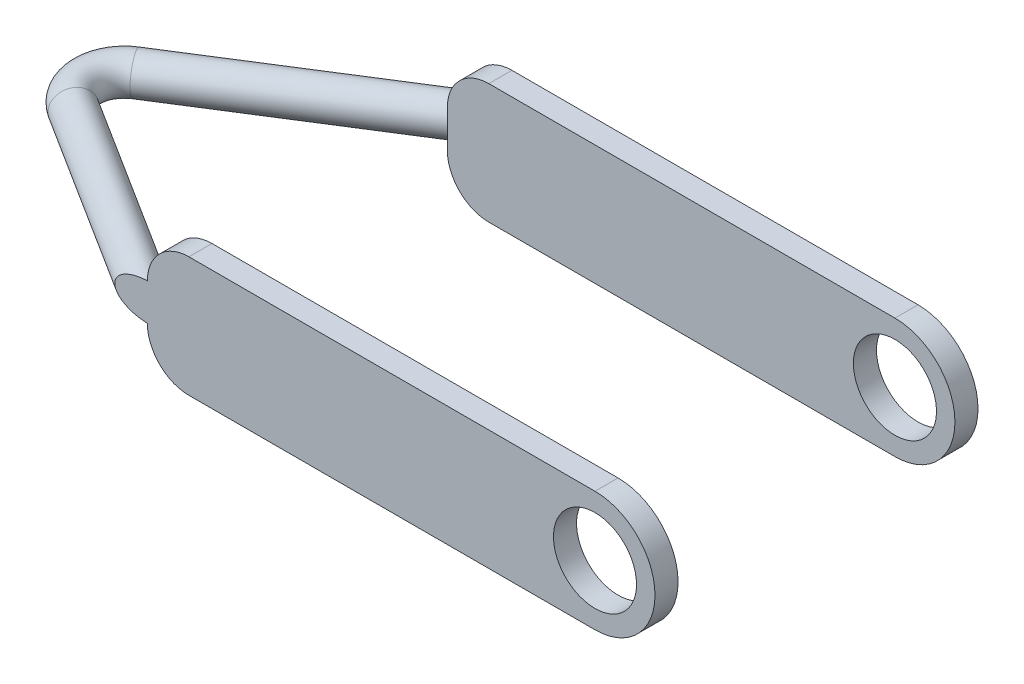
ISO-10303-21;
HEADER;
FILE_DESCRIPTION(('STEP AP214'),'2;1');
FILE_NAME('part.step','',(''),(''),'','','');
FILE_SCHEMA(('AUTOMOTIVE_DESIGN { 1 0 10303 214 1 1 1 1 }'));
ENDSEC;
DATA;
#1=APPLICATION_CONTEXT('core data for automotive mechanical design processes');
#2=APPLICATION_PROTOCOL_DEFINITION('international standard','automotive_design',2000,#1);
#3=PRODUCT_CONTEXT('',#1,'mechanical');
#4=PRODUCT('Part','Part','',(#3));
#5=PRODUCT_RELATED_PRODUCT_CATEGORY('part','',(#4));
#6=PRODUCT_DEFINITION_FORMATION('','',#4);
#7=PRODUCT_DEFINITION_CONTEXT('part definition',#1,'design');
#8=PRODUCT_DEFINITION('design','',#6,#7);
#9=PRODUCT_DEFINITION_SHAPE('','',#8);
#10=(LENGTH_UNIT() NAMED_UNIT(*) SI_UNIT(.MILLI.,.METRE.));
#11=(NAMED_UNIT(*) PLANE_ANGLE_UNIT() SI_UNIT($,.RADIAN.));
#12=(NAMED_UNIT(*) SI_UNIT($,.STERADIAN.) SOLID_ANGLE_UNIT());
#13=UNCERTAINTY_MEASURE_WITH_UNIT(LENGTH_MEASURE(1.E-05),#10,'distance_accuracy_value','');
#14=(GEOMETRIC_REPRESENTATION_CONTEXT(3) GLOBAL_UNCERTAINTY_ASSIGNED_CONTEXT((#13)) GLOBAL_UNIT_ASSIGNED_CONTEXT((#10,
#11,#12)) REPRESENTATION_CONTEXT('',''));
#15=CARTESIAN_POINT('',(0.,0.,0.));
#16=DIRECTION('',(0.,0.,1.));
#17=DIRECTION('',(1.,0.,0.));
#18=AXIS2_PLACEMENT_3D('',#15,#16,#17);
#19=CARTESIAN_POINT('',(44.0000000000021,13.,-30.0000000000036));
#20=DIRECTION('',(-1.,0.,0.));
#21=DIRECTION('',(0.,0.,1.));
#22=AXIS2_PLACEMENT_3D('',#19,#20,#21);
#23=PLANE('',#22);
#24=DIRECTION('',(0.,-1.,0.));
#25=VECTOR('',#24,1.);
#26=CARTESIAN_POINT('',(44.0000000000021,13.,-35.0000000000036));
#27=LINE('',#26,#25);
#28=CARTESIAN_POINT('',(44.0000000000021,-3.99354347611105,-35.0000000000036));
#29=VERTEX_POINT('',#28);
#30=CARTESIAN_POINT('',(44.0000000000021,-3.99999999999994,-35.0000000000036));
#31=VERTEX_POINT('',#30);
#32=EDGE_CURVE('E174',#29,#31,#27,.T.);
#33=ORIENTED_EDGE('',*,*,#32,.T.);
#34=DIRECTION('',(0.,0.,-1.));
#35=VECTOR('',#34,1.);
#36=CARTESIAN_POINT('',(44.0000000000021,-3.99999999999994,-25.0000000000036));
#37=LINE('',#36,#35);
#38=CARTESIAN_POINT('',(44.0000000000021,-3.99999999999994,-34.7312871896512));
#39=VERTEX_POINT('',#38);
#40=EDGE_CURVE('E391',#39,#31,#37,.T.);
#41=ORIENTED_EDGE('',*,*,#40,.F.);
#42=CARTESIAN_POINT('',(44.0000000000021,0.,-34.7312871896512));
#43=DIRECTION('',(1.,0.,0.));
#44=DIRECTION('',(0.,0.,-1.));
#45=AXIS2_PLACEMENT_3D('',#42,#43,#44);
#46=ELLIPSE('',#45,4.73128718964752,4.);
#47=EDGE_CURVE('E265',#29,#39,#46,.F.);
#48=ORIENTED_EDGE('',*,*,#47,.F.);
#49=EDGE_LOOP('',(#33,#41,#48));
#50=FACE_BOUND('',#49,.T.);
#51=ADVANCED_FACE('F36',(#50),#23,.T.);
#52=CARTESIAN_POINT('',(44.0000000000021,0.,-30.0000000000036));
#53=VERTEX_POINT('',#52);
#54=EDGE_CURVE('E269',#39,#53,#46,.F.);
#55=ORIENTED_EDGE('',*,*,#54,.F.);
#56=CARTESIAN_POINT('',(44.0000000000021,-3.99999999999994,-30.0000000000036));
#57=VERTEX_POINT('',#56);
#58=EDGE_CURVE('E293',#57,#39,#37,.T.);
#59=ORIENTED_EDGE('',*,*,#58,.F.);
#60=DIRECTION('',(0.,-1.,0.));
#61=VECTOR('',#60,1.);
#62=CARTESIAN_POINT('',(44.0000000000021,13.,-30.0000000000036));
#63=LINE('',#62,#61);
#64=EDGE_CURVE('E188',#53,#57,#63,.T.);
#65=ORIENTED_EDGE('',*,*,#64,.F.);
#66=EDGE_LOOP('',(#55,#59,#65));
#67=FACE_BOUND('',#66,.T.);
#68=ADVANCED_FACE('F322',(#67),#23,.T.);
#69=CARTESIAN_POINT('',(0.,-13.,0.));
#70=DIRECTION('',(0.,1.,0.));
#71=DIRECTION('',(0.,0.,-1.));
#72=AXIS2_PLACEMENT_3D('',#69,#70,#71);
#73=PLANE('',#72);
#74=DIRECTION('',(0.,0.,-1.));
#75=VECTOR('',#74,1.);
#76=CARTESIAN_POINT('',(53.0000000000021,-13.,-25.0000000000036));
#77=LINE('',#76,#75);
#78=CARTESIAN_POINT('',(53.0000000000022,-13.,-35.0000000000036));
#79=VERTEX_POINT('',#78);
#80=CARTESIAN_POINT('',(53.0000000000022,-13.,-30.0000000000036));
#81=VERTEX_POINT('',#80);
#82=EDGE_CURVE('E11',#79,#81,#77,.F.);
#83=ORIENTED_EDGE('',*,*,#82,.F.);
#84=DIRECTION('',(1.,0.,0.));
#85=VECTOR('',#84,1.);
#86=CARTESIAN_POINT('',(44.0000000000021,-13.,-35.0000000000036));
#87=LINE('',#86,#85);
#88=CARTESIAN_POINT('',(141.000000000002,-13.,-35.0000000000036));
#89=VERTEX_POINT('',#88);
#90=EDGE_CURVE('E179',#79,#89,#87,.T.);
#91=ORIENTED_EDGE('',*,*,#90,.T.);
#92=DIRECTION('',(0.,0.,-1.));
#93=VECTOR('',#92,1.);
#94=CARTESIAN_POINT('',(141.000000000002,-13.,-25.0000000000036));
#95=LINE('',#94,#93);
#96=CARTESIAN_POINT('',(141.000000000002,-13.,-30.0000000000036));
#97=VERTEX_POINT('',#96);
#98=EDGE_CURVE('E44',#89,#97,#95,.F.);
#99=ORIENTED_EDGE('',*,*,#98,.T.);
#100=DIRECTION('',(-1.,0.,0.));
#101=VECTOR('',#100,1.);
#102=CARTESIAN_POINT('',(154.000000000002,-13.,-30.0000000000036));
#103=LINE('',#102,#101);
#104=EDGE_CURVE('E183',#97,#81,#103,.T.);
#105=ORIENTED_EDGE('',*,*,#104,.T.);
#106=EDGE_LOOP('',(#83,#91,#99,#105));
#107=FACE_BOUND('',#106,.T.);
#108=ADVANCED_FACE('F279',(#107),#73,.F.);
#109=CARTESIAN_POINT('',(0.,-10.,-35.0000000000036));
#110=DIRECTION('',(0.,0.,-1.));
#111=DIRECTION('',(-1.,0.,0.));
#112=AXIS2_PLACEMENT_3D('',#109,#110,#111);
#113=PLANE('',#112);
#114=DIRECTION('',(1.,0.,0.));
#115=VECTOR('',#114,1.);
#116=CARTESIAN_POINT('',(44.0000000000021,13.,-35.0000000000036));
#117=LINE('',#116,#115);
#118=CARTESIAN_POINT('',(53.0000000000022,13.,-35.0000000000036));
#119=VERTEX_POINT('',#118);
#120=CARTESIAN_POINT('',(141.000000000002,13.,-35.0000000000036));
#121=VERTEX_POINT('',#120);
#122=EDGE_CURVE('E166',#119,#121,#117,.T.);
#123=ORIENTED_EDGE('',*,*,#122,.T.);
#124=CARTESIAN_POINT('',(141.000000000002,0.,-35.0000000000036));
#125=DIRECTION('',(0.,0.,1.));
#126=DIRECTION('',(1.,0.,0.));
#127=AXIS2_PLACEMENT_3D('',#124,#125,#126);
#128=CIRCLE('',#127,13.);
#129=EDGE_CURVE('E152',#89,#121,#128,.T.);
#130=ORIENTED_EDGE('',*,*,#129,.F.);
#131=ORIENTED_EDGE('',*,*,#90,.F.);
#132=CARTESIAN_POINT('',(53.0000000000021,-4.,-35.0000000000036));
#133=DIRECTION('',(0.,0.,1.));
#134=DIRECTION('',(1.,0.,0.));
#135=AXIS2_PLACEMENT_3D('',#132,#133,#134);
#136=CIRCLE('',#135,9.);
#137=EDGE_CURVE('E58',#31,#79,#136,.T.);
#138=ORIENTED_EDGE('',*,*,#137,.F.);
#139=ORIENTED_EDGE('',*,*,#32,.F.);
#140=CARTESIAN_POINT('',(44.4253684188356,0.,-35.0000000000036));
#141=DIRECTION('',(0.,0.,-1.));
#142=DIRECTION('',(1.,0.,0.));
#143=AXIS2_PLACEMENT_3D('',#140,#141,#142);
#144=ELLIPSE('',#143,7.48955789739853,4.);
#145=CARTESIAN_POINT('',(44.0000000000021,3.99354347611105,-35.0000000000036));
#146=VERTEX_POINT('',#145);
#147=EDGE_CURVE('E268',#146,#29,#144,.F.);
#148=ORIENTED_EDGE('',*,*,#147,.F.);
#149=CARTESIAN_POINT('',(44.0000000000021,3.99999999999994,-35.0000000000036));
#150=VERTEX_POINT('',#149);
#151=EDGE_CURVE('E177',#150,#146,#27,.T.);
#152=ORIENTED_EDGE('',*,*,#151,.F.);
#153=CARTESIAN_POINT('',(53.0000000000021,4.,-35.0000000000036));
#154=DIRECTION('',(0.,0.,-1.));
#155=DIRECTION('',(-1.,0.,0.));
#156=AXIS2_PLACEMENT_3D('',#153,#154,#155);
#157=CIRCLE('',#156,9.);
#158=EDGE_CURVE('E173',#150,#119,#157,.T.);
#159=ORIENTED_EDGE('',*,*,#158,.T.);
#160=EDGE_LOOP('',(#123,#130,#131,#138,#139,#148,#152,#159));
#161=FACE_BOUND('',#160,.T.);
#162=CARTESIAN_POINT('',(141.000000000002,0.,-35.0000000000036));
#163=DIRECTION('',(0.,0.,-1.));
#164=DIRECTION('',(-1.,0.,0.));
#165=AXIS2_PLACEMENT_3D('',#162,#163,#164);
#166=CIRCLE('',#165,9.00000000000001);
#167=CARTESIAN_POINT('',(132.000000000002,0.,-35.0000000000036));
#168=VERTEX_POINT('',#167);
#169=EDGE_CURVE('E186',#168,#168,#166,.F.);
#170=ORIENTED_EDGE('',*,*,#169,.T.);
#171=EDGE_LOOP('',(#170));
#172=FACE_BOUND('',#171,.T.);
#173=ADVANCED_FACE('F170',(#161,#172),#113,.T.);
#174=CARTESIAN_POINT('',(44.0000000000021,3.99999999999994,-30.0000000000036));
#175=VERTEX_POINT('',#174);
#176=EDGE_CURVE('E189',#175,#53,#63,.T.);
#177=ORIENTED_EDGE('',*,*,#176,.F.);
#178=DIRECTION('',(0.,0.,-1.));
#179=VECTOR('',#178,1.);
#180=CARTESIAN_POINT('',(44.0000000000021,3.99999999999994,-22.0000000000036));
#181=LINE('',#180,#179);
#182=CARTESIAN_POINT('',(44.0000000000021,3.99999999999994,-34.7312871896512));
#183=VERTEX_POINT('',#182);
#184=EDGE_CURVE('E291',#175,#183,#181,.T.);
#185=ORIENTED_EDGE('',*,*,#184,.T.);
#186=EDGE_CURVE('E270',#53,#183,#46,.F.);
#187=ORIENTED_EDGE('',*,*,#186,.F.);
#188=EDGE_LOOP('',(#177,#185,#187));
#189=FACE_BOUND('',#188,.T.);
#190=ADVANCED_FACE('F317',(#189),#23,.T.);
#191=EDGE_CURVE('E264',#183,#146,#46,.F.);
#192=ORIENTED_EDGE('',*,*,#191,.F.);
#193=EDGE_CURVE('E288',#183,#150,#181,.T.);
#194=ORIENTED_EDGE('',*,*,#193,.T.);
#195=ORIENTED_EDGE('',*,*,#151,.T.);
#196=EDGE_LOOP('',(#192,#194,#195));
#197=FACE_BOUND('',#196,.T.);
#198=ADVANCED_FACE('F309',(#197),#23,.T.);
#199=CARTESIAN_POINT('',(154.000000000002,13.,-30.0000000000036));
#200=DIRECTION('',(0.,0.,1.));
#201=DIRECTION('',(1.,0.,0.));
#202=AXIS2_PLACEMENT_3D('',#199,#200,#201);
#203=PLANE('',#202);
#204=CARTESIAN_POINT('',(141.000000000002,0.,-30.0000000000036));
#205=DIRECTION('',(0.,0.,1.));
#206=DIRECTION('',(1.,0.,0.));
#207=AXIS2_PLACEMENT_3D('',#204,#205,#206);
#208=CIRCLE('',#207,13.);
#209=CARTESIAN_POINT('',(141.000000000002,13.,-30.0000000000036));
#210=VERTEX_POINT('',#209);
#211=EDGE_CURVE('E51',#210,#97,#208,.F.);
#212=ORIENTED_EDGE('',*,*,#211,.F.);
#213=DIRECTION('',(-1.,0.,0.));
#214=VECTOR('',#213,1.);
#215=CARTESIAN_POINT('',(154.000000000002,13.,-30.0000000000036));
#216=LINE('',#215,#214);
#217=CARTESIAN_POINT('',(53.0000000000022,13.,-30.0000000000036));
#218=VERTEX_POINT('',#217);
#219=EDGE_CURVE('E167',#210,#218,#216,.T.);
#220=ORIENTED_EDGE('',*,*,#219,.T.);
#221=CARTESIAN_POINT('',(53.0000000000021,4.,-30.0000000000036));
#222=DIRECTION('',(0.,0.,1.));
#223=DIRECTION('',(1.,0.,0.));
#224=AXIS2_PLACEMENT_3D('',#221,#222,#223);
#225=CIRCLE('',#224,9.);
#226=EDGE_CURVE('E296',#218,#175,#225,.T.);
#227=ORIENTED_EDGE('',*,*,#226,.T.);
#228=ORIENTED_EDGE('',*,*,#176,.T.);
#229=ORIENTED_EDGE('',*,*,#64,.T.);
#230=CARTESIAN_POINT('',(53.0000000000021,-4.,-30.0000000000036));
#231=DIRECTION('',(0.,0.,1.));
#232=DIRECTION('',(1.,0.,0.));
#233=AXIS2_PLACEMENT_3D('',#230,#231,#232);
#234=CIRCLE('',#233,9.);
#235=EDGE_CURVE('E285',#81,#57,#234,.F.);
#236=ORIENTED_EDGE('',*,*,#235,.F.);
#237=ORIENTED_EDGE('',*,*,#104,.F.);
#238=EDGE_LOOP('',(#212,#220,#227,#228,#229,#236,#237));
#239=FACE_BOUND('',#238,.T.);
#240=CARTESIAN_POINT('',(141.000000000002,0.,-30.0000000000036));
#241=DIRECTION('',(0.,0.,1.));
#242=DIRECTION('',(1.,0.,0.));
#243=AXIS2_PLACEMENT_3D('',#240,#241,#242);
#244=CIRCLE('',#243,9.00000000000001);
#245=CARTESIAN_POINT('',(132.000000000002,0.,-30.0000000000036));
#246=VERTEX_POINT('',#245);
#247=EDGE_CURVE('E275',#246,#246,#244,.F.);
#248=ORIENTED_EDGE('',*,*,#247,.T.);
#249=EDGE_LOOP('',(#248));
#250=FACE_BOUND('',#249,.T.);
#251=ADVANCED_FACE('F282',(#239,#250),#203,.T.);
#252=CARTESIAN_POINT('',(0.,13.,0.));
#253=DIRECTION('',(0.,1.,0.));
#254=DIRECTION('',(0.,0.,-1.));
#255=AXIS2_PLACEMENT_3D('',#252,#253,#254);
#256=PLANE('',#255);
#257=DIRECTION('',(0.,0.,-1.));
#258=VECTOR('',#257,1.);
#259=CARTESIAN_POINT('',(141.000000000002,13.,-25.0000000000036));
#260=LINE('',#259,#258);
#261=EDGE_CURVE('E155',#210,#121,#260,.T.);
#262=ORIENTED_EDGE('',*,*,#261,.T.);
#263=ORIENTED_EDGE('',*,*,#122,.F.);
#264=DIRECTION('',(0.,0.,1.));
#265=VECTOR('',#264,1.);
#266=CARTESIAN_POINT('',(53.0000000000022,13.,0.));
#267=LINE('',#266,#265);
#268=EDGE_CURVE('E273',#119,#218,#267,.T.);
#269=ORIENTED_EDGE('',*,*,#268,.T.);
#270=ORIENTED_EDGE('',*,*,#219,.F.);
#271=EDGE_LOOP('',(#262,#263,#269,#270));
#272=FACE_BOUND('',#271,.T.);
#273=ADVANCED_FACE('F164',(#272),#256,.T.);
#274=CARTESIAN_POINT('',(-0.272615345039458,0.,-6.76348712672022));
#275=DIRECTION('',(0.845435890840099,0.,-0.534076918130159));
#276=DIRECTION('',(-0.534076918130159,0.,-0.845435890840099));
#277=AXIS2_PLACEMENT_3D('',#274,#275,#276);
#278=CYLINDRICAL_SURFACE('',#277,4.);
#279=CARTESIAN_POINT('',(-0.272615345039476,0.,-6.76348712672021));
#280=DIRECTION('',(-0.845435890840099,0.,0.534076918130159));
#281=DIRECTION('',(0.534076918130159,0.,0.845435890840099));
#282=AXIS2_PLACEMENT_3D('',#279,#280,#281);
#283=CIRCLE('',#282,4.);
#284=CARTESIAN_POINT('',(-2.40892301756011,0.,-10.1452306900806));
#285=VERTEX_POINT('',#284);
#286=EDGE_CURVE('E192',#285,#285,#283,.F.);
#287=ORIENTED_EDGE('',*,*,#286,.T.);
#288=EDGE_LOOP('',(#287));
#289=FACE_BOUND('',#288,.T.);
#290=ORIENTED_EDGE('',*,*,#47,.T.);
#291=ORIENTED_EDGE('',*,*,#54,.T.);
#292=ORIENTED_EDGE('',*,*,#186,.T.);
#293=ORIENTED_EDGE('',*,*,#191,.T.);
#294=ORIENTED_EDGE('',*,*,#147,.T.);
#295=EDGE_LOOP('',(#290,#291,#292,#293,#294));
#296=FACE_BOUND('',#295,.T.);
#297=ADVANCED_FACE('F315',(#289,#296),#278,.T.);
#298=CARTESIAN_POINT('',(0.,-10.,35.0000000000036));
#299=DIRECTION('',(0.,0.,-1.));
#300=DIRECTION('',(-1.,0.,0.));
#301=AXIS2_PLACEMENT_3D('',#298,#299,#300);
#302=PLANE('',#301);
#303=CARTESIAN_POINT('',(141.000000000002,0.,35.0000000000036));
#304=DIRECTION('',(0.,0.,-1.));
#305=DIRECTION('',(-1.,0.,0.));
#306=AXIS2_PLACEMENT_3D('',#303,#304,#305);
#307=CIRCLE('',#306,9.00000000000001);
#308=CARTESIAN_POINT('',(150.000000000002,0.,35.0000000000036));
#309=VERTEX_POINT('',#308);
#310=EDGE_CURVE('E218',#309,#309,#307,.T.);
#311=ORIENTED_EDGE('',*,*,#310,.T.);
#312=EDGE_LOOP('',(#311));
#313=FACE_BOUND('',#312,.T.);
#314=CARTESIAN_POINT('',(141.000000000002,0.,35.0000000000036));
#315=DIRECTION('',(0.,0.,1.));
#316=DIRECTION('',(1.,0.,0.));
#317=AXIS2_PLACEMENT_3D('',#314,#315,#316);
#318=CIRCLE('',#317,13.);
#319=CARTESIAN_POINT('',(141.000000000002,-13.,35.0000000000036));
#320=VERTEX_POINT('',#319);
#321=CARTESIAN_POINT('',(141.000000000002,13.,35.0000000000036));
#322=VERTEX_POINT('',#321);
#323=EDGE_CURVE('E195',#320,#322,#318,.T.);
#324=ORIENTED_EDGE('',*,*,#323,.T.);
#325=DIRECTION('',(1.,0.,0.));
#326=VECTOR('',#325,1.);
#327=CARTESIAN_POINT('',(44.0000000000021,13.,35.0000000000036));
#328=LINE('',#327,#326);
#329=CARTESIAN_POINT('',(53.0000000000021,13.,35.0000000000036));
#330=VERTEX_POINT('',#329);
#331=EDGE_CURVE('E222',#330,#322,#328,.T.);
#332=ORIENTED_EDGE('',*,*,#331,.F.);
#333=CARTESIAN_POINT('',(53.0000000000021,4.,35.0000000000036));
#334=DIRECTION('',(0.,0.,-1.));
#335=DIRECTION('',(-1.,0.,0.));
#336=AXIS2_PLACEMENT_3D('',#333,#334,#335);
#337=CIRCLE('',#336,9.);
#338=CARTESIAN_POINT('',(44.0000000000021,3.99999999999994,35.0000000000036));
#339=VERTEX_POINT('',#338);
#340=EDGE_CURVE('E214',#330,#339,#337,.F.);
#341=ORIENTED_EDGE('',*,*,#340,.T.);
#342=DIRECTION('',(0.,-1.,0.));
#343=VECTOR('',#342,1.);
#344=CARTESIAN_POINT('',(44.0000000000021,13.,35.0000000000036));
#345=LINE('',#344,#343);
#346=CARTESIAN_POINT('',(44.0000000000021,3.99354347611106,35.0000000000036));
#347=VERTEX_POINT('',#346);
#348=EDGE_CURVE('E237',#339,#347,#345,.T.);
#349=ORIENTED_EDGE('',*,*,#348,.T.);
#350=CARTESIAN_POINT('',(44.4253684188356,0.,35.0000000000036));
#351=DIRECTION('',(0.,0.,-1.));
#352=DIRECTION('',(1.,0.,0.));
#353=AXIS2_PLACEMENT_3D('',#350,#351,#352);
#354=ELLIPSE('',#353,7.48955789739853,4.);
#355=CARTESIAN_POINT('',(44.0000000000021,-3.99354347611105,35.0000000000036));
#356=VERTEX_POINT('',#355);
#357=EDGE_CURVE('E246',#347,#356,#354,.F.);
#358=ORIENTED_EDGE('',*,*,#357,.T.);
#359=CARTESIAN_POINT('',(44.0000000000021,-3.99999999999994,35.0000000000036));
#360=VERTEX_POINT('',#359);
#361=EDGE_CURVE('E236',#356,#360,#345,.T.);
#362=ORIENTED_EDGE('',*,*,#361,.T.);
#363=CARTESIAN_POINT('',(53.0000000000021,-4.,35.0000000000036));
#364=DIRECTION('',(0.,0.,1.));
#365=DIRECTION('',(1.,0.,0.));
#366=AXIS2_PLACEMENT_3D('',#363,#364,#365);
#367=CIRCLE('',#366,9.);
#368=CARTESIAN_POINT('',(53.0000000000022,-13.,35.0000000000036));
#369=VERTEX_POINT('',#368);
#370=EDGE_CURVE('E196',#360,#369,#367,.T.);
#371=ORIENTED_EDGE('',*,*,#370,.T.);
#372=DIRECTION('',(1.,0.,0.));
#373=VECTOR('',#372,1.);
#374=CARTESIAN_POINT('',(44.0000000000021,-13.,35.0000000000036));
#375=LINE('',#374,#373);
#376=EDGE_CURVE('E221',#369,#320,#375,.T.);
#377=ORIENTED_EDGE('',*,*,#376,.T.);
#378=EDGE_LOOP('',(#324,#332,#341,#349,#358,#362,#371,#377));
#379=FACE_BOUND('',#378,.T.);
#380=ADVANCED_FACE('F333',(#313,#379),#302,.F.);
#381=CARTESIAN_POINT('',(154.000000000002,13.,30.0000000000036));
#382=DIRECTION('',(0.,0.,1.));
#383=DIRECTION('',(1.,0.,0.));
#384=AXIS2_PLACEMENT_3D('',#381,#382,#383);
#385=PLANE('',#384);
#386=CARTESIAN_POINT('',(141.000000000002,0.,30.0000000000036));
#387=DIRECTION('',(0.,0.,1.));
#388=DIRECTION('',(1.,0.,0.));
#389=AXIS2_PLACEMENT_3D('',#386,#387,#388);
#390=CIRCLE('',#389,9.00000000000001);
#391=CARTESIAN_POINT('',(150.000000000002,0.,30.0000000000036));
#392=VERTEX_POINT('',#391);
#393=EDGE_CURVE('E217',#392,#392,#390,.T.);
#394=ORIENTED_EDGE('',*,*,#393,.T.);
#395=EDGE_LOOP('',(#394));
#396=FACE_BOUND('',#395,.T.);
#397=DIRECTION('',(-1.,0.,0.));
#398=VECTOR('',#397,1.);
#399=CARTESIAN_POINT('',(154.000000000002,13.,30.0000000000036));
#400=LINE('',#399,#398);
#401=CARTESIAN_POINT('',(141.000000000002,13.,30.0000000000036));
#402=VERTEX_POINT('',#401);
#403=CARTESIAN_POINT('',(53.0000000000022,13.,30.0000000000036));
#404=VERTEX_POINT('',#403);
#405=EDGE_CURVE('E225',#402,#404,#400,.T.);
#406=ORIENTED_EDGE('',*,*,#405,.F.);
#407=CARTESIAN_POINT('',(141.000000000002,0.,30.0000000000036));
#408=DIRECTION('',(0.,0.,1.));
#409=DIRECTION('',(1.,0.,0.));
#410=AXIS2_PLACEMENT_3D('',#407,#408,#409);
#411=CIRCLE('',#410,13.);
#412=CARTESIAN_POINT('',(141.000000000002,-13.,30.0000000000036));
#413=VERTEX_POINT('',#412);
#414=EDGE_CURVE('E204',#413,#402,#411,.T.);
#415=ORIENTED_EDGE('',*,*,#414,.F.);
#416=DIRECTION('',(-1.,0.,0.));
#417=VECTOR('',#416,1.);
#418=CARTESIAN_POINT('',(154.000000000002,-13.,30.0000000000036));
#419=LINE('',#418,#417);
#420=CARTESIAN_POINT('',(53.0000000000021,-13.,30.0000000000036));
#421=VERTEX_POINT('',#420);
#422=EDGE_CURVE('E226',#413,#421,#419,.T.);
#423=ORIENTED_EDGE('',*,*,#422,.T.);
#424=CARTESIAN_POINT('',(53.0000000000021,-4.,30.0000000000036));
#425=DIRECTION('',(0.,0.,1.));
#426=DIRECTION('',(1.,0.,0.));
#427=AXIS2_PLACEMENT_3D('',#424,#425,#426);
#428=CIRCLE('',#427,9.);
#429=CARTESIAN_POINT('',(44.0000000000021,-3.99999999999994,30.0000000000036));
#430=VERTEX_POINT('',#429);
#431=EDGE_CURVE('E206',#430,#421,#428,.T.);
#432=ORIENTED_EDGE('',*,*,#431,.F.);
#433=DIRECTION('',(0.,-1.,0.));
#434=VECTOR('',#433,1.);
#435=CARTESIAN_POINT('',(44.0000000000021,13.,30.0000000000036));
#436=LINE('',#435,#434);
#437=CARTESIAN_POINT('',(44.0000000000021,0.,30.0000000000036));
#438=VERTEX_POINT('',#437);
#439=EDGE_CURVE('E228',#438,#430,#436,.T.);
#440=ORIENTED_EDGE('',*,*,#439,.F.);
#441=CARTESIAN_POINT('',(44.0000000000021,3.99999999999994,30.0000000000036));
#442=VERTEX_POINT('',#441);
#443=EDGE_CURVE('E233',#442,#438,#436,.T.);
#444=ORIENTED_EDGE('',*,*,#443,.F.);
#445=CARTESIAN_POINT('',(53.0000000000021,4.,30.0000000000036));
#446=DIRECTION('',(0.,0.,1.));
#447=DIRECTION('',(1.,0.,0.));
#448=AXIS2_PLACEMENT_3D('',#445,#446,#447);
#449=CIRCLE('',#448,9.);
#450=EDGE_CURVE('E211',#442,#404,#449,.F.);
#451=ORIENTED_EDGE('',*,*,#450,.T.);
#452=EDGE_LOOP('',(#406,#415,#423,#432,#440,#444,#451));
#453=FACE_BOUND('',#452,.T.);
#454=ADVANCED_FACE('F362',(#396,#453),#385,.F.);
#455=CARTESIAN_POINT('',(44.0000000000021,13.,30.0000000000036));
#456=DIRECTION('',(1.,0.,0.));
#457=DIRECTION('',(0.,0.,-1.));
#458=AXIS2_PLACEMENT_3D('',#455,#456,#457);
#459=PLANE('',#458);
#460=ORIENTED_EDGE('',*,*,#439,.T.);
#461=DIRECTION('',(0.,0.,1.));
#462=VECTOR('',#461,1.);
#463=CARTESIAN_POINT('',(44.0000000000021,-3.99999999999994,25.0000000000036));
#464=LINE('',#463,#462);
#465=CARTESIAN_POINT('',(44.0000000000021,-3.99999999999994,34.7312871896512));
#466=VERTEX_POINT('',#465);
#467=EDGE_CURVE('E202',#430,#466,#464,.T.);
#468=ORIENTED_EDGE('',*,*,#467,.T.);
#469=CARTESIAN_POINT('',(44.0000000000021,0.,34.7312871896512));
#470=DIRECTION('',(-1.,0.,0.));
#471=DIRECTION('',(0.,0.,1.));
#472=AXIS2_PLACEMENT_3D('',#469,#470,#471);
#473=ELLIPSE('',#472,4.73128718964752,4.);
#474=EDGE_CURVE('E247',#466,#438,#473,.F.);
#475=ORIENTED_EDGE('',*,*,#474,.T.);
#476=EDGE_LOOP('',(#460,#468,#475));
#477=FACE_BOUND('',#476,.T.);
#478=ADVANCED_FACE('F360',(#477),#459,.F.);
#479=CARTESIAN_POINT('',(0.,-13.,0.));
#480=DIRECTION('',(0.,1.,0.));
#481=DIRECTION('',(0.,0.,1.));
#482=AXIS2_PLACEMENT_3D('',#479,#480,#481);
#483=PLANE('',#482);
#484=DIRECTION('',(0.,0.,1.));
#485=VECTOR('',#484,1.);
#486=CARTESIAN_POINT('',(53.0000000000021,-13.,25.0000000000036));
#487=LINE('',#486,#485);
#488=EDGE_CURVE('E259',#421,#369,#487,.T.);
#489=ORIENTED_EDGE('',*,*,#488,.F.);
#490=ORIENTED_EDGE('',*,*,#422,.F.);
#491=DIRECTION('',(0.,0.,1.));
#492=VECTOR('',#491,1.);
#493=CARTESIAN_POINT('',(141.000000000002,-13.,25.0000000000036));
#494=LINE('',#493,#492);
#495=EDGE_CURVE('E254',#413,#320,#494,.T.);
#496=ORIENTED_EDGE('',*,*,#495,.T.);
#497=ORIENTED_EDGE('',*,*,#376,.F.);
#498=EDGE_LOOP('',(#489,#490,#496,#497));
#499=FACE_BOUND('',#498,.T.);
#500=ADVANCED_FACE('F356',(#499),#483,.F.);
#501=ORIENTED_EDGE('',*,*,#348,.F.);
#502=DIRECTION('',(0.,0.,1.));
#503=VECTOR('',#502,1.);
#504=CARTESIAN_POINT('',(44.0000000000021,3.99999999999994,22.0000000000036));
#505=LINE('',#504,#503);
#506=CARTESIAN_POINT('',(44.0000000000021,3.99999999999994,34.7312871896512));
#507=VERTEX_POINT('',#506);
#508=EDGE_CURVE('E208',#507,#339,#505,.T.);
#509=ORIENTED_EDGE('',*,*,#508,.F.);
#510=EDGE_CURVE('E242',#507,#347,#473,.F.);
#511=ORIENTED_EDGE('',*,*,#510,.T.);
#512=EDGE_LOOP('',(#501,#509,#511));
#513=FACE_BOUND('',#512,.T.);
#514=ADVANCED_FACE('F359',(#513),#459,.F.);
#515=CARTESIAN_POINT('',(4.00000000000143,0.,0.));
#516=DIRECTION('',(0.,1.,0.));
#517=DIRECTION('',(0.,0.,1.));
#518=AXIS2_PLACEMENT_3D('',#515,#516,#517);
#519=TOROIDAL_SURFACE('',#518,7.99999999999931,4.);
#520=CARTESIAN_POINT('',(-0.272615345039476,0.,6.76348712672021));
#521=DIRECTION('',(0.845435890840099,0.,0.534076918130159));
#522=DIRECTION('',(0.534076918130159,0.,-0.845435890840099));
#523=AXIS2_PLACEMENT_3D('',#520,#521,#522);
#524=CIRCLE('',#523,4.);
#525=CARTESIAN_POINT('',(-2.40892301756011,0.,10.1452306900806));
#526=VERTEX_POINT('',#525);
#527=EDGE_CURVE('E239',#526,#526,#524,.T.);
#528=CARTESIAN_POINT('',(4.00000000000143,0.,0.));
#529=DIRECTION('',(0.,1.,0.));
#530=DIRECTION('',(0.,0.,1.));
#531=AXIS2_PLACEMENT_3D('',#528,#529,#530);
#532=CIRCLE('',#531,11.9999999999993);
#533=EDGE_CURVE('',#285,#526,#532,.T.);
#534=ORIENTED_EDGE('',*,*,#286,.F.);
#535=ORIENTED_EDGE('',*,*,#527,.F.);
#536=ORIENTED_EDGE('',*,*,#533,.T.);
#537=ORIENTED_EDGE('',*,*,#533,.F.);
#538=EDGE_LOOP('',(#534,#536,#535,#537));
#539=FACE_BOUND('',#538,.T.);
#540=ADVANCED_FACE('F370',(#539),#519,.T.);
#541=CARTESIAN_POINT('',(-0.272615345039458,0.,6.76348712672022));
#542=DIRECTION('',(0.845435890840099,0.,0.534076918130159));
#543=DIRECTION('',(0.534076918130159,0.,-0.845435890840099));
#544=AXIS2_PLACEMENT_3D('',#541,#542,#543);
#545=CYLINDRICAL_SURFACE('',#544,4.);
#546=ORIENTED_EDGE('',*,*,#357,.F.);
#547=ORIENTED_EDGE('',*,*,#510,.F.);
#548=EDGE_CURVE('E248',#438,#507,#473,.F.);
#549=ORIENTED_EDGE('',*,*,#548,.F.);
#550=ORIENTED_EDGE('',*,*,#474,.F.);
#551=EDGE_CURVE('E243',#356,#466,#473,.F.);
#552=ORIENTED_EDGE('',*,*,#551,.F.);
#553=EDGE_LOOP('',(#546,#547,#549,#550,#552));
#554=FACE_BOUND('',#553,.T.);
#555=ORIENTED_EDGE('',*,*,#527,.T.);
#556=EDGE_LOOP('',(#555));
#557=FACE_BOUND('',#556,.T.);
#558=ADVANCED_FACE('F38',(#554,#557),#545,.T.);
#559=ORIENTED_EDGE('',*,*,#551,.T.);
#560=EDGE_CURVE('E199',#466,#360,#464,.T.);
#561=ORIENTED_EDGE('',*,*,#560,.T.);
#562=ORIENTED_EDGE('',*,*,#361,.F.);
#563=EDGE_LOOP('',(#559,#561,#562));
#564=FACE_BOUND('',#563,.T.);
#565=ADVANCED_FACE('F366',(#564),#459,.F.);
#566=ORIENTED_EDGE('',*,*,#548,.T.);
#567=EDGE_CURVE('E210',#442,#507,#505,.T.);
#568=ORIENTED_EDGE('',*,*,#567,.F.);
#569=ORIENTED_EDGE('',*,*,#443,.T.);
#570=EDGE_LOOP('',(#566,#568,#569));
#571=FACE_BOUND('',#570,.T.);
#572=ADVANCED_FACE('F354',(#571),#459,.F.);
#573=CARTESIAN_POINT('',(0.,13.,0.));
#574=DIRECTION('',(0.,1.,0.));
#575=DIRECTION('',(0.,0.,1.));
#576=AXIS2_PLACEMENT_3D('',#573,#574,#575);
#577=PLANE('',#576);
#578=DIRECTION('',(0.,0.,1.));
#579=VECTOR('',#578,1.);
#580=CARTESIAN_POINT('',(141.000000000002,13.,25.0000000000036));
#581=LINE('',#580,#579);
#582=EDGE_CURVE('E261',#402,#322,#581,.T.);
#583=ORIENTED_EDGE('',*,*,#582,.F.);
#584=ORIENTED_EDGE('',*,*,#405,.T.);
#585=DIRECTION('',(0.,0.,1.));
#586=VECTOR('',#585,1.);
#587=CARTESIAN_POINT('',(53.0000000000021,13.,22.0000000000036));
#588=LINE('',#587,#586);
#589=EDGE_CURVE('E251',#330,#404,#588,.F.);
#590=ORIENTED_EDGE('',*,*,#589,.F.);
#591=ORIENTED_EDGE('',*,*,#331,.T.);
#592=EDGE_LOOP('',(#583,#584,#590,#591));
#593=FACE_BOUND('',#592,.T.);
#594=ADVANCED_FACE('F350',(#593),#577,.T.);
#595=CARTESIAN_POINT('',(53.0000000000021,4.,22.0000000000036));
#596=DIRECTION('',(0.,0.,1.));
#597=DIRECTION('',(1.,0.,0.));
#598=AXIS2_PLACEMENT_3D('',#595,#596,#597);
#599=CYLINDRICAL_SURFACE('',#598,9.);
#600=ORIENTED_EDGE('',*,*,#589,.T.);
#601=ORIENTED_EDGE('',*,*,#450,.F.);
#602=ORIENTED_EDGE('',*,*,#567,.T.);
#603=ORIENTED_EDGE('',*,*,#508,.T.);
#604=ORIENTED_EDGE('',*,*,#340,.F.);
#605=EDGE_LOOP('',(#600,#601,#602,#603,#604));
#606=FACE_BOUND('',#605,.T.);
#607=ADVANCED_FACE('F346',(#606),#599,.T.);
#608=CARTESIAN_POINT('',(141.000000000002,0.,22.0000000000036));
#609=DIRECTION('',(0.,0.,1.));
#610=DIRECTION('',(1.,0.,0.));
#611=AXIS2_PLACEMENT_3D('',#608,#609,#610);
#612=CYLINDRICAL_SURFACE('',#611,9.00000000000001);
#613=CARTESIAN_POINT('',(150.000000000002,0.,30.0000000000036));
#614=CARTESIAN_POINT('',(150.000000000002,0.,30.052083333337));
#615=CARTESIAN_POINT('',(150.000000000002,0.,30.1041666666703));
#616=CARTESIAN_POINT('',(150.000000000002,0.,30.208333333337));
#617=CARTESIAN_POINT('',(150.000000000002,0.,30.2604166666703));
#618=CARTESIAN_POINT('',(150.000000000002,0.,30.364583333337));
#619=CARTESIAN_POINT('',(150.000000000002,0.,30.4166666666703));
#620=CARTESIAN_POINT('',(150.000000000002,0.,30.520833333337));
#621=CARTESIAN_POINT('',(150.000000000002,0.,30.5729166666703));
#622=CARTESIAN_POINT('',(150.000000000002,0.,30.677083333337));
#623=CARTESIAN_POINT('',(150.000000000002,0.,30.7291666666703));
#624=CARTESIAN_POINT('',(150.000000000002,0.,30.833333333337));
#625=CARTESIAN_POINT('',(150.000000000002,0.,30.8854166666703));
#626=CARTESIAN_POINT('',(150.000000000002,0.,30.989583333337));
#627=CARTESIAN_POINT('',(150.000000000002,0.,31.0416666666703));
#628=CARTESIAN_POINT('',(150.000000000002,0.,31.145833333337));
#629=CARTESIAN_POINT('',(150.000000000002,0.,31.1979166666703));
#630=CARTESIAN_POINT('',(150.000000000002,0.,31.302083333337));
#631=CARTESIAN_POINT('',(150.000000000002,0.,31.3541666666703));
#632=CARTESIAN_POINT('',(150.000000000002,0.,31.458333333337));
#633=CARTESIAN_POINT('',(150.000000000002,0.,31.5104166666703));
#634=CARTESIAN_POINT('',(150.000000000002,0.,31.614583333337));
#635=CARTESIAN_POINT('',(150.000000000002,0.,31.6666666666703));
#636=CARTESIAN_POINT('',(150.000000000002,0.,31.770833333337));
#637=CARTESIAN_POINT('',(150.000000000002,0.,31.8229166666703));
#638=CARTESIAN_POINT('',(150.000000000002,0.,31.927083333337));
#639=CARTESIAN_POINT('',(150.000000000002,0.,31.9791666666703));
#640=CARTESIAN_POINT('',(150.000000000002,0.,32.083333333337));
#641=CARTESIAN_POINT('',(150.000000000002,0.,32.1354166666703));
#642=CARTESIAN_POINT('',(150.000000000002,0.,32.239583333337));
#643=CARTESIAN_POINT('',(150.000000000002,0.,32.2916666666703));
#644=CARTESIAN_POINT('',(150.000000000002,0.,32.395833333337));
#645=CARTESIAN_POINT('',(150.000000000002,0.,32.4479166666703));
#646=CARTESIAN_POINT('',(150.000000000002,0.,32.552083333337));
#647=CARTESIAN_POINT('',(150.000000000002,0.,32.6041666666703));
#648=CARTESIAN_POINT('',(150.000000000002,0.,32.708333333337));
#649=CARTESIAN_POINT('',(150.000000000002,0.,32.7604166666703));
#650=CARTESIAN_POINT('',(150.000000000002,0.,32.864583333337));
#651=CARTESIAN_POINT('',(150.000000000002,0.,32.9166666666703));
#652=CARTESIAN_POINT('',(150.000000000002,0.,33.020833333337));
#653=CARTESIAN_POINT('',(150.000000000002,0.,33.0729166666703));
#654=CARTESIAN_POINT('',(150.000000000002,0.,33.177083333337));
#655=CARTESIAN_POINT('',(150.000000000002,0.,33.2291666666703));
#656=CARTESIAN_POINT('',(150.000000000002,0.,33.333333333337));
#657=CARTESIAN_POINT('',(150.000000000002,0.,33.3854166666703));
#658=CARTESIAN_POINT('',(150.000000000002,0.,33.489583333337));
#659=CARTESIAN_POINT('',(150.000000000002,0.,33.5416666666703));
#660=CARTESIAN_POINT('',(150.000000000002,0.,33.645833333337));
#661=CARTESIAN_POINT('',(150.000000000002,0.,33.6979166666703));
#662=CARTESIAN_POINT('',(150.000000000002,0.,33.802083333337));
#663=CARTESIAN_POINT('',(150.000000000002,0.,33.8541666666703));
#664=CARTESIAN_POINT('',(150.000000000002,0.,33.958333333337));
#665=CARTESIAN_POINT('',(150.000000000002,0.,34.0104166666703));
#666=CARTESIAN_POINT('',(150.000000000002,0.,34.114583333337));
#667=CARTESIAN_POINT('',(150.000000000002,0.,34.1666666666703));
#668=CARTESIAN_POINT('',(150.000000000002,0.,34.270833333337));
#669=CARTESIAN_POINT('',(150.000000000002,0.,34.3229166666703));
#670=CARTESIAN_POINT('',(150.000000000002,0.,34.427083333337));
#671=CARTESIAN_POINT('',(150.000000000002,0.,34.4791666666703));
#672=CARTESIAN_POINT('',(150.000000000002,0.,34.583333333337));
#673=CARTESIAN_POINT('',(150.000000000002,0.,34.6354166666703));
#674=CARTESIAN_POINT('',(150.000000000002,0.,34.739583333337));
#675=CARTESIAN_POINT('',(150.000000000002,0.,34.7916666666703));
#676=CARTESIAN_POINT('',(150.000000000002,0.,34.895833333337));
#677=CARTESIAN_POINT('',(150.000000000002,0.,34.9479166666703));
#678=CARTESIAN_POINT('',(150.000000000002,0.,35.0000000000036));
#679=B_SPLINE_CURVE_WITH_KNOTS('',3,(#613,#614,#615,#616,#617,#618,#619,#620,#621,#622,#623,
#624,#625,#626,#627,#628,#629,#630,#631,#632,#633,#634,#635,#636,#637,#638,#639,#640,#641,#642,
#643,#644,#645,#646,#647,#648,#649,#650,#651,#652,#653,#654,#655,#656,#657,#658,#659,#660,#661,
#662,#663,#664,#665,#666,#667,#668,#669,#670,#671,#672,#673,#674,#675,#676,#677,#678),
.UNSPECIFIED.,.F.,.F.,(4,2,2,2,2,2,2,2,2,2,2,2,2,2,2,2,2,2,2,2,2,2,2,2,2,2,2,2,2,2,2,2,4),(0.,
0.156249999999997,0.3125,0.468749999999997,0.625000000000001,0.781249999999997,
0.937500000000001,1.09375,1.25,1.40625,1.5625,1.71875,1.875,2.03125000000001,2.1875,2.34375,2.5,
2.65625000000001,2.8125,2.96875,3.125,3.28125000000001,3.4375,3.59375000000001,3.75,
3.90625000000001,4.0625,4.21875000000001,4.375,4.53125000000001,4.6875,4.84375000000001,5.),.UNSPECIFIED.);
#680=EDGE_CURVE('BSEAM342',#392,#309,#679,.T.);
#681=ORIENTED_EDGE('',*,*,#393,.F.);
#682=ORIENTED_EDGE('',*,*,#310,.F.);
#683=ORIENTED_EDGE('',*,*,#680,.T.);
#684=ORIENTED_EDGE('',*,*,#680,.F.);
#685=EDGE_LOOP('',(#681,#683,#682,#684));
#686=FACE_BOUND('',#685,.T.);
#687=ADVANCED_FACE('F342',(#686),#612,.F.);
#688=CARTESIAN_POINT('',(141.000000000002,0.,25.0000000000036));
#689=DIRECTION('',(0.,0.,1.));
#690=DIRECTION('',(1.,0.,0.));
#691=AXIS2_PLACEMENT_3D('',#688,#689,#690);
#692=CYLINDRICAL_SURFACE('',#691,13.);
#693=ORIENTED_EDGE('',*,*,#414,.T.);
#694=ORIENTED_EDGE('',*,*,#582,.T.);
#695=ORIENTED_EDGE('',*,*,#323,.F.);
#696=ORIENTED_EDGE('',*,*,#495,.F.);
#697=EDGE_LOOP('',(#693,#694,#695,#696));
#698=FACE_BOUND('',#697,.T.);
#699=ADVANCED_FACE('F338',(#698),#692,.T.);
#700=CARTESIAN_POINT('',(53.0000000000021,-4.,25.0000000000036));
#701=DIRECTION('',(0.,0.,1.));
#702=DIRECTION('',(1.,0.,0.));
#703=AXIS2_PLACEMENT_3D('',#700,#701,#702);
#704=CYLINDRICAL_SURFACE('',#703,9.);
#705=ORIENTED_EDGE('',*,*,#431,.T.);
#706=ORIENTED_EDGE('',*,*,#488,.T.);
#707=ORIENTED_EDGE('',*,*,#370,.F.);
#708=ORIENTED_EDGE('',*,*,#560,.F.);
#709=ORIENTED_EDGE('',*,*,#467,.F.);
#710=EDGE_LOOP('',(#705,#706,#707,#708,#709));
#711=FACE_BOUND('',#710,.T.);
#712=ADVANCED_FACE('F335',(#711),#704,.T.);
#713=CARTESIAN_POINT('',(53.0000000000021,4.,-22.0000000000036));
#714=DIRECTION('',(0.,0.,-1.));
#715=DIRECTION('',(-1.,0.,0.));
#716=AXIS2_PLACEMENT_3D('',#713,#714,#715);
#717=CYLINDRICAL_SURFACE('',#716,9.);
#718=ORIENTED_EDGE('',*,*,#193,.F.);
#719=ORIENTED_EDGE('',*,*,#184,.F.);
#720=ORIENTED_EDGE('',*,*,#226,.F.);
#721=ORIENTED_EDGE('',*,*,#268,.F.);
#722=ORIENTED_EDGE('',*,*,#158,.F.);
#723=EDGE_LOOP('',(#718,#719,#720,#721,#722));
#724=FACE_BOUND('',#723,.T.);
#725=ADVANCED_FACE('F305',(#724),#717,.T.);
#726=CARTESIAN_POINT('',(141.000000000002,0.,-22.0000000000036));
#727=DIRECTION('',(0.,0.,-1.));
#728=DIRECTION('',(-1.,0.,0.));
#729=AXIS2_PLACEMENT_3D('',#726,#727,#728);
#730=CYLINDRICAL_SURFACE('',#729,9.00000000000001);
#731=CARTESIAN_POINT('',(132.000000000002,0.,-35.0000000000036));
#732=CARTESIAN_POINT('',(132.000000000002,0.,-34.9479166666703));
#733=CARTESIAN_POINT('',(132.000000000002,0.,-34.895833333337));
#734=CARTESIAN_POINT('',(132.000000000002,0.,-34.7916666666703));
#735=CARTESIAN_POINT('',(132.000000000002,0.,-34.739583333337));
#736=CARTESIAN_POINT('',(132.000000000002,0.,-34.6354166666703));
#737=CARTESIAN_POINT('',(132.000000000002,0.,-34.583333333337));
#738=CARTESIAN_POINT('',(132.000000000002,0.,-34.4791666666703));
#739=CARTESIAN_POINT('',(132.000000000002,0.,-34.427083333337));
#740=CARTESIAN_POINT('',(132.000000000002,0.,-34.3229166666703));
#741=CARTESIAN_POINT('',(132.000000000002,0.,-34.270833333337));
#742=CARTESIAN_POINT('',(132.000000000002,0.,-34.1666666666703));
#743=CARTESIAN_POINT('',(132.000000000002,0.,-34.114583333337));
#744=CARTESIAN_POINT('',(132.000000000002,0.,-34.0104166666703));
#745=CARTESIAN_POINT('',(132.000000000002,0.,-33.958333333337));
#746=CARTESIAN_POINT('',(132.000000000002,0.,-33.8541666666703));
#747=CARTESIAN_POINT('',(132.000000000002,0.,-33.802083333337));
#748=CARTESIAN_POINT('',(132.000000000002,0.,-33.6979166666703));
#749=CARTESIAN_POINT('',(132.000000000002,0.,-33.645833333337));
#750=CARTESIAN_POINT('',(132.000000000002,0.,-33.5416666666703));
#751=CARTESIAN_POINT('',(132.000000000002,0.,-33.489583333337));
#752=CARTESIAN_POINT('',(132.000000000002,0.,-33.3854166666703));
#753=CARTESIAN_POINT('',(132.000000000002,0.,-33.333333333337));
#754=CARTESIAN_POINT('',(132.000000000002,0.,-33.2291666666703));
#755=CARTESIAN_POINT('',(132.000000000002,0.,-33.177083333337));
#756=CARTESIAN_POINT('',(132.000000000002,0.,-33.0729166666703));
#757=CARTESIAN_POINT('',(132.000000000002,0.,-33.020833333337));
#758=CARTESIAN_POINT('',(132.000000000002,0.,-32.9166666666703));
#759=CARTESIAN_POINT('',(132.000000000002,0.,-32.864583333337));
#760=CARTESIAN_POINT('',(132.000000000002,0.,-32.7604166666703));
#761=CARTESIAN_POINT('',(132.000000000002,0.,-32.708333333337));
#762=CARTESIAN_POINT('',(132.000000000002,0.,-32.6041666666703));
#763=CARTESIAN_POINT('',(132.000000000002,0.,-32.552083333337));
#764=CARTESIAN_POINT('',(132.000000000002,0.,-32.4479166666703));
#765=CARTESIAN_POINT('',(132.000000000002,0.,-32.395833333337));
#766=CARTESIAN_POINT('',(132.000000000002,0.,-32.2916666666703));
#767=CARTESIAN_POINT('',(132.000000000002,0.,-32.239583333337));
#768=CARTESIAN_POINT('',(132.000000000002,0.,-32.1354166666703));
#769=CARTESIAN_POINT('',(132.000000000002,0.,-32.083333333337));
#770=CARTESIAN_POINT('',(132.000000000002,0.,-31.9791666666703));
#771=CARTESIAN_POINT('',(132.000000000002,0.,-31.927083333337));
#772=CARTESIAN_POINT('',(132.000000000002,0.,-31.8229166666703));
#773=CARTESIAN_POINT('',(132.000000000002,0.,-31.770833333337));
#774=CARTESIAN_POINT('',(132.000000000002,0.,-31.6666666666703));
#775=CARTESIAN_POINT('',(132.000000000002,0.,-31.614583333337));
#776=CARTESIAN_POINT('',(132.000000000002,0.,-31.5104166666703));
#777=CARTESIAN_POINT('',(132.000000000002,0.,-31.458333333337));
#778=CARTESIAN_POINT('',(132.000000000002,0.,-31.3541666666703));
#779=CARTESIAN_POINT('',(132.000000000002,0.,-31.302083333337));
#780=CARTESIAN_POINT('',(132.000000000002,0.,-31.1979166666703));
#781=CARTESIAN_POINT('',(132.000000000002,0.,-31.145833333337));
#782=CARTESIAN_POINT('',(132.000000000002,0.,-31.0416666666703));
#783=CARTESIAN_POINT('',(132.000000000002,0.,-30.989583333337));
#784=CARTESIAN_POINT('',(132.000000000002,0.,-30.8854166666703));
#785=CARTESIAN_POINT('',(132.000000000002,0.,-30.833333333337));
#786=CARTESIAN_POINT('',(132.000000000002,0.,-30.7291666666703));
#787=CARTESIAN_POINT('',(132.000000000002,0.,-30.677083333337));
#788=CARTESIAN_POINT('',(132.000000000002,0.,-30.5729166666703));
#789=CARTESIAN_POINT('',(132.000000000002,0.,-30.520833333337));
#790=CARTESIAN_POINT('',(132.000000000002,0.,-30.4166666666703));
#791=CARTESIAN_POINT('',(132.000000000002,0.,-30.364583333337));
#792=CARTESIAN_POINT('',(132.000000000002,0.,-30.2604166666703));
#793=CARTESIAN_POINT('',(132.000000000002,0.,-30.208333333337));
#794=CARTESIAN_POINT('',(132.000000000002,0.,-30.1041666666703));
#795=CARTESIAN_POINT('',(132.000000000002,0.,-30.052083333337));
#796=CARTESIAN_POINT('',(132.000000000002,0.,-30.0000000000036));
#797=B_SPLINE_CURVE_WITH_KNOTS('',3,(#731,#732,#733,#734,#735,#736,#737,#738,#739,#740,#741,
#742,#743,#744,#745,#746,#747,#748,#749,#750,#751,#752,#753,#754,#755,#756,#757,#758,#759,#760,
#761,#762,#763,#764,#765,#766,#767,#768,#769,#770,#771,#772,#773,#774,#775,#776,#777,#778,#779,
#780,#781,#782,#783,#784,#785,#786,#787,#788,#789,#790,#791,#792,#793,#794,#795,#796),
.UNSPECIFIED.,.F.,.F.,(4,2,2,2,2,2,2,2,2,2,2,2,2,2,2,2,2,2,2,2,2,2,2,2,2,2,2,2,2,2,2,2,4),(0.,
0.156250000000004,0.3125,0.468750000000004,0.625000000000001,0.781250000000004,
0.937500000000001,1.09375,1.25,1.40625,1.5625,1.71875,1.875,2.03125000000001,2.1875,2.34375,2.5,
2.65625000000001,2.8125,2.96875,3.125,3.28125000000001,3.4375,3.59375,3.75,3.90625,4.0625,
4.21875,4.375,4.53125,4.6875,4.84375,5.),.UNSPECIFIED.);
#798=EDGE_CURVE('BSEAM302',#168,#246,#797,.T.);
#799=ORIENTED_EDGE('',*,*,#169,.F.);
#800=ORIENTED_EDGE('',*,*,#247,.F.);
#801=ORIENTED_EDGE('',*,*,#798,.T.);
#802=ORIENTED_EDGE('',*,*,#798,.F.);
#803=EDGE_LOOP('',(#799,#801,#800,#802));
#804=FACE_BOUND('',#803,.T.);
#805=ADVANCED_FACE('F302',(#804),#730,.F.);
#806=CARTESIAN_POINT('',(141.000000000002,0.,-25.0000000000036));
#807=DIRECTION('',(0.,0.,-1.));
#808=DIRECTION('',(-1.,0.,0.));
#809=AXIS2_PLACEMENT_3D('',#806,#807,#808);
#810=CYLINDRICAL_SURFACE('',#809,13.);
#811=ORIENTED_EDGE('',*,*,#211,.T.);
#812=ORIENTED_EDGE('',*,*,#98,.F.);
#813=ORIENTED_EDGE('',*,*,#129,.T.);
#814=ORIENTED_EDGE('',*,*,#261,.F.);
#815=EDGE_LOOP('',(#811,#812,#813,#814));
#816=FACE_BOUND('',#815,.T.);
#817=ADVANCED_FACE('F154',(#816),#810,.T.);
#818=CARTESIAN_POINT('',(53.0000000000021,-4.,-25.0000000000036));
#819=DIRECTION('',(0.,0.,-1.));
#820=DIRECTION('',(-1.,0.,0.));
#821=AXIS2_PLACEMENT_3D('',#818,#819,#820);
#822=CYLINDRICAL_SURFACE('',#821,9.);
#823=ORIENTED_EDGE('',*,*,#235,.T.);
#824=ORIENTED_EDGE('',*,*,#58,.T.);
#825=ORIENTED_EDGE('',*,*,#40,.T.);
#826=ORIENTED_EDGE('',*,*,#137,.T.);
#827=ORIENTED_EDGE('',*,*,#82,.T.);
#828=EDGE_LOOP('',(#823,#824,#825,#826,#827));
#829=FACE_BOUND('',#828,.T.);
#830=ADVANCED_FACE('F394',(#829),#822,.T.);
#831=CLOSED_SHELL('',(#51,#68,#108,#173,#190,#198,#251,#273,#297,#380,#454,#478,#500,#514,#540,
#558,#565,#572,#594,#607,#687,#699,#712,#725,#805,#817,#830));
#832=MANIFOLD_SOLID_BREP('B2',#831);
#833=ADVANCED_BREP_SHAPE_REPRESENTATION('',(#18,#832),#14);
#834=SHAPE_DEFINITION_REPRESENTATION(#9,#833);
ENDSEC;
END-ISO-10303-21;
